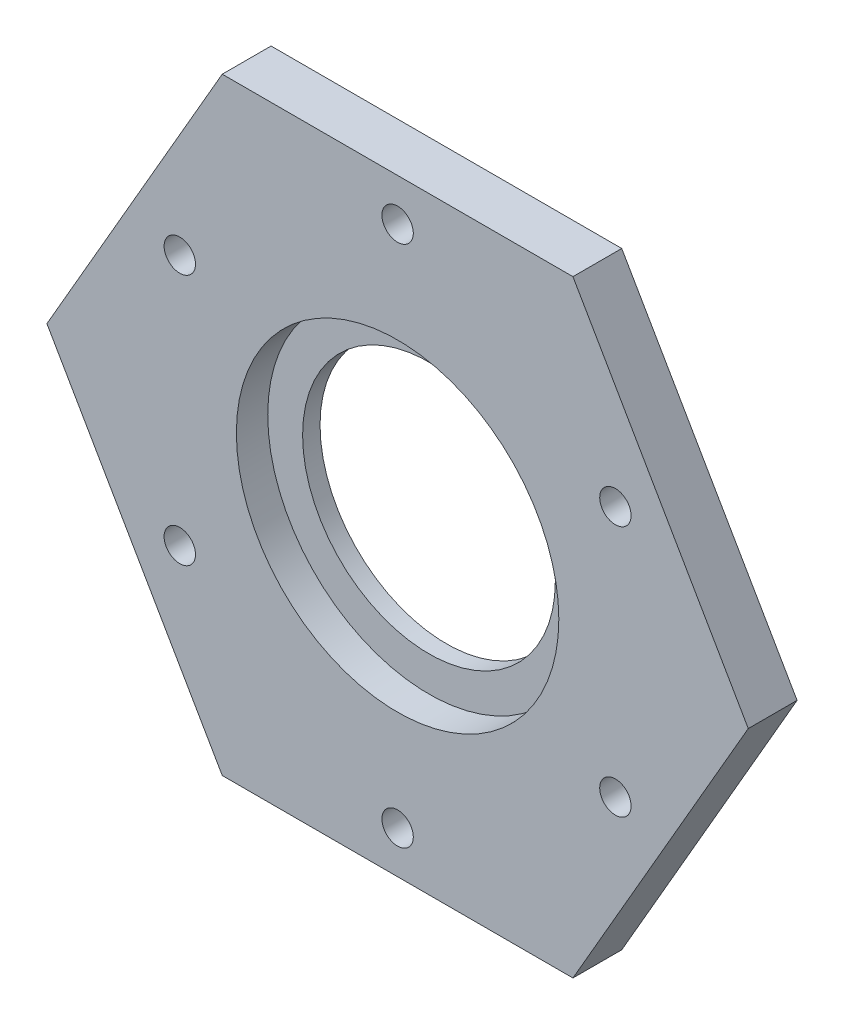
ISO-10303-21;
HEADER;
FILE_DESCRIPTION(('STEP AP214'),'2;1');
FILE_NAME('part.step','',(''),(''),'','','');
FILE_SCHEMA(('AUTOMOTIVE_DESIGN { 1 0 10303 214 1 1 1 1 }'));
ENDSEC;
DATA;
#1=APPLICATION_CONTEXT('core data for automotive mechanical design processes');
#2=APPLICATION_PROTOCOL_DEFINITION('international standard','automotive_design',2000,#1);
#3=PRODUCT_CONTEXT('',#1,'mechanical');
#4=PRODUCT('Part','Part','',(#3));
#5=PRODUCT_RELATED_PRODUCT_CATEGORY('part','',(#4));
#6=PRODUCT_DEFINITION_FORMATION('','',#4);
#7=PRODUCT_DEFINITION_CONTEXT('part definition',#1,'design');
#8=PRODUCT_DEFINITION('design','',#6,#7);
#9=PRODUCT_DEFINITION_SHAPE('','',#8);
#10=(LENGTH_UNIT() NAMED_UNIT(*) SI_UNIT(.MILLI.,.METRE.));
#11=(NAMED_UNIT(*) PLANE_ANGLE_UNIT() SI_UNIT($,.RADIAN.));
#12=(NAMED_UNIT(*) SI_UNIT($,.STERADIAN.) SOLID_ANGLE_UNIT());
#13=UNCERTAINTY_MEASURE_WITH_UNIT(LENGTH_MEASURE(1.E-05),#10,'distance_accuracy_value','');
#14=(GEOMETRIC_REPRESENTATION_CONTEXT(3) GLOBAL_UNCERTAINTY_ASSIGNED_CONTEXT((#13)) GLOBAL_UNIT_ASSIGNED_CONTEXT((#10,
#11,#12)) REPRESENTATION_CONTEXT('',''));
#15=CARTESIAN_POINT('',(0.,0.,0.));
#16=DIRECTION('',(0.,0.,1.));
#17=DIRECTION('',(1.,0.,0.));
#18=AXIS2_PLACEMENT_3D('',#15,#16,#17);
#19=CARTESIAN_POINT('',(0.,0.,-3.8));
#20=DIRECTION('',(0.,0.,1.));
#21=DIRECTION('',(1.,0.,0.));
#22=AXIS2_PLACEMENT_3D('',#19,#20,#21);
#23=CYLINDRICAL_SURFACE('',#22,9.25);
#24=CARTESIAN_POINT('',(0.,0.,-1.));
#25=DIRECTION('',(0.,0.,-1.));
#26=DIRECTION('',(-1.,0.,0.));
#27=AXIS2_PLACEMENT_3D('',#24,#25,#26);
#28=CIRCLE('',#27,9.25);
#29=CARTESIAN_POINT('',(-9.25,0.,-1.));
#30=VERTEX_POINT('',#29);
#31=EDGE_CURVE('E11',#30,#30,#28,.T.);
#32=ORIENTED_EDGE('',*,*,#31,.F.);
#33=EDGE_LOOP('',(#32));
#34=FACE_BOUND('',#33,.T.);
#35=CARTESIAN_POINT('',(0.,0.,-2.8));
#36=DIRECTION('',(0.,0.,-1.));
#37=DIRECTION('',(-1.,0.,0.));
#38=AXIS2_PLACEMENT_3D('',#35,#36,#37);
#39=CIRCLE('',#38,9.25);
#40=CARTESIAN_POINT('',(-9.25,0.,-2.8));
#41=VERTEX_POINT('',#40);
#42=EDGE_CURVE('E182',#41,#41,#39,.T.);
#43=ORIENTED_EDGE('',*,*,#42,.T.);
#44=EDGE_LOOP('',(#43));
#45=FACE_BOUND('',#44,.T.);
#46=ADVANCED_FACE('F39',(#34,#45),#23,.F.);
#47=CARTESIAN_POINT('',(-10.0594010767583,17.4233937586589,-1.));
#48=DIRECTION('',(0.,-1.,0.));
#49=DIRECTION('',(1.,0.,0.));
#50=AXIS2_PLACEMENT_3D('',#47,#48,#49);
#51=PLANE('',#50);
#52=DIRECTION('',(0.,0.,1.));
#53=VECTOR('',#52,1.);
#54=CARTESIAN_POINT('',(-10.0594010767583,17.4233937586589,-1.));
#55=LINE('',#54,#53);
#56=CARTESIAN_POINT('',(-10.0594010767583,17.4233937586589,-3.8));
#57=VERTEX_POINT('',#56);
#58=CARTESIAN_POINT('',(-10.0594010767583,17.4233937586589,-1.));
#59=VERTEX_POINT('',#58);
#60=EDGE_CURVE('E113',#57,#59,#55,.T.);
#61=ORIENTED_EDGE('',*,*,#60,.T.);
#62=DIRECTION('',(1.,0.,0.));
#63=VECTOR('',#62,1.);
#64=CARTESIAN_POINT('',(-10.0594010767583,17.4233937586589,-1.));
#65=LINE('',#64,#63);
#66=CARTESIAN_POINT('',(10.0594010767585,17.4233937586588,-1.));
#67=VERTEX_POINT('',#66);
#68=EDGE_CURVE('E57',#59,#67,#65,.T.);
#69=ORIENTED_EDGE('',*,*,#68,.T.);
#70=DIRECTION('',(0.,0.,1.));
#71=VECTOR('',#70,1.);
#72=CARTESIAN_POINT('',(10.0594010767585,17.4233937586588,-1.));
#73=LINE('',#72,#71);
#74=CARTESIAN_POINT('',(10.0594010767585,17.4233937586588,-3.8));
#75=VERTEX_POINT('',#74);
#76=EDGE_CURVE('E49',#75,#67,#73,.T.);
#77=ORIENTED_EDGE('',*,*,#76,.F.);
#78=DIRECTION('',(1.,0.,0.));
#79=VECTOR('',#78,1.);
#80=CARTESIAN_POINT('',(-10.0594010767583,17.4233937586589,-3.8));
#81=LINE('',#80,#79);
#82=EDGE_CURVE('E141',#57,#75,#81,.T.);
#83=ORIENTED_EDGE('',*,*,#82,.F.);
#84=EDGE_LOOP('',(#61,#69,#77,#83));
#85=FACE_BOUND('',#84,.T.);
#86=ADVANCED_FACE('F41',(#85),#51,.F.);
#87=CARTESIAN_POINT('',(10.0594010767585,17.4233937586588,-1.));
#88=DIRECTION('',(-0.866025403784439,-0.5,0.));
#89=DIRECTION('',(0.5,-0.866025403784439,0.));
#90=AXIS2_PLACEMENT_3D('',#87,#88,#89);
#91=PLANE('',#90);
#92=ORIENTED_EDGE('',*,*,#76,.T.);
#93=DIRECTION('',(0.5,-0.866025403784439,0.));
#94=VECTOR('',#93,1.);
#95=CARTESIAN_POINT('',(10.0594010767585,17.4233937586588,-1.));
#96=LINE('',#95,#94);
#97=CARTESIAN_POINT('',(20.118802153517,0.,-1.));
#98=VERTEX_POINT('',#97);
#99=EDGE_CURVE('E135',#67,#98,#96,.T.);
#100=ORIENTED_EDGE('',*,*,#99,.T.);
#101=DIRECTION('',(0.,0.,1.));
#102=VECTOR('',#101,1.);
#103=CARTESIAN_POINT('',(20.118802153517,0.,-1.));
#104=LINE('',#103,#102);
#105=CARTESIAN_POINT('',(20.118802153517,0.,-3.8));
#106=VERTEX_POINT('',#105);
#107=EDGE_CURVE('E126',#106,#98,#104,.T.);
#108=ORIENTED_EDGE('',*,*,#107,.F.);
#109=DIRECTION('',(0.5,-0.866025403784439,0.));
#110=VECTOR('',#109,1.);
#111=CARTESIAN_POINT('',(10.0594010767585,17.4233937586588,-3.8));
#112=LINE('',#111,#110);
#113=EDGE_CURVE('E137',#75,#106,#112,.T.);
#114=ORIENTED_EDGE('',*,*,#113,.F.);
#115=EDGE_LOOP('',(#92,#100,#108,#114));
#116=FACE_BOUND('',#115,.T.);
#117=ADVANCED_FACE('F134',(#116),#91,.F.);
#118=CARTESIAN_POINT('',(20.118802153517,0.,-1.));
#119=DIRECTION('',(-0.866025403784437,0.500000000000002,0.));
#120=DIRECTION('',(-0.500000000000002,-0.866025403784437,0.));
#121=AXIS2_PLACEMENT_3D('',#118,#119,#120);
#122=PLANE('',#121);
#123=ORIENTED_EDGE('',*,*,#107,.T.);
#124=DIRECTION('',(-0.500000000000002,-0.866025403784437,0.));
#125=VECTOR('',#124,1.);
#126=CARTESIAN_POINT('',(20.118802153517,0.,-1.));
#127=LINE('',#126,#125);
#128=CARTESIAN_POINT('',(10.0594010767584,-17.4233937586588,-1.));
#129=VERTEX_POINT('',#128);
#130=EDGE_CURVE('E170',#98,#129,#127,.T.);
#131=ORIENTED_EDGE('',*,*,#130,.T.);
#132=DIRECTION('',(0.,0.,1.));
#133=VECTOR('',#132,1.);
#134=CARTESIAN_POINT('',(10.0594010767584,-17.4233937586588,-1.));
#135=LINE('',#134,#133);
#136=CARTESIAN_POINT('',(10.0594010767584,-17.4233937586588,-3.8));
#137=VERTEX_POINT('',#136);
#138=EDGE_CURVE('E117',#137,#129,#135,.T.);
#139=ORIENTED_EDGE('',*,*,#138,.F.);
#140=DIRECTION('',(-0.500000000000002,-0.866025403784437,0.));
#141=VECTOR('',#140,1.);
#142=CARTESIAN_POINT('',(20.118802153517,0.,-3.8));
#143=LINE('',#142,#141);
#144=EDGE_CURVE('E151',#106,#137,#143,.T.);
#145=ORIENTED_EDGE('',*,*,#144,.F.);
#146=EDGE_LOOP('',(#123,#131,#139,#145));
#147=FACE_BOUND('',#146,.T.);
#148=ADVANCED_FACE('F273',(#147),#122,.F.);
#149=CARTESIAN_POINT('',(10.0594010767584,-17.4233937586588,-1.));
#150=DIRECTION('',(0.,1.,0.));
#151=DIRECTION('',(-1.,0.,0.));
#152=AXIS2_PLACEMENT_3D('',#149,#150,#151);
#153=PLANE('',#152);
#154=ORIENTED_EDGE('',*,*,#138,.T.);
#155=DIRECTION('',(-1.,0.,0.));
#156=VECTOR('',#155,1.);
#157=CARTESIAN_POINT('',(10.0594010767584,-17.4233937586588,-1.));
#158=LINE('',#157,#156);
#159=CARTESIAN_POINT('',(-10.0594010767586,-17.4233937586587,-1.));
#160=VERTEX_POINT('',#159);
#161=EDGE_CURVE('E166',#129,#160,#158,.T.);
#162=ORIENTED_EDGE('',*,*,#161,.T.);
#163=DIRECTION('',(0.,0.,1.));
#164=VECTOR('',#163,1.);
#165=CARTESIAN_POINT('',(-10.0594010767586,-17.4233937586587,-1.));
#166=LINE('',#165,#164);
#167=CARTESIAN_POINT('',(-10.0594010767586,-17.4233937586587,-3.8));
#168=VERTEX_POINT('',#167);
#169=EDGE_CURVE('E105',#168,#160,#166,.T.);
#170=ORIENTED_EDGE('',*,*,#169,.F.);
#171=DIRECTION('',(-1.,0.,0.));
#172=VECTOR('',#171,1.);
#173=CARTESIAN_POINT('',(10.0594010767584,-17.4233937586588,-3.8));
#174=LINE('',#173,#172);
#175=EDGE_CURVE('E159',#137,#168,#174,.T.);
#176=ORIENTED_EDGE('',*,*,#175,.F.);
#177=EDGE_LOOP('',(#154,#162,#170,#176));
#178=FACE_BOUND('',#177,.T.);
#179=ADVANCED_FACE('F165',(#178),#153,.F.);
#180=CARTESIAN_POINT('',(-10.0594010767586,-17.4233937586587,-1.));
#181=DIRECTION('',(0.866025403784442,0.499999999999994,0.));
#182=DIRECTION('',(-0.499999999999994,0.866025403784442,0.));
#183=AXIS2_PLACEMENT_3D('',#180,#181,#182);
#184=PLANE('',#183);
#185=ORIENTED_EDGE('',*,*,#169,.T.);
#186=DIRECTION('',(0.499999999999994,-0.866025403784442,0.));
#187=VECTOR('',#186,1.);
#188=CARTESIAN_POINT('',(-4.73557497366824,-26.6445310598728,-1.));
#189=LINE('',#188,#187);
#190=CARTESIAN_POINT('',(-20.118802153517,1.59594559789866E-13,-1.));
#191=VERTEX_POINT('',#190);
#192=EDGE_CURVE('E96',#191,#160,#189,.T.);
#193=ORIENTED_EDGE('',*,*,#192,.F.);
#194=DIRECTION('',(0.,0.,1.));
#195=VECTOR('',#194,1.);
#196=CARTESIAN_POINT('',(-20.118802153517,1.6826817716975E-13,-1.));
#197=LINE('',#196,#195);
#198=CARTESIAN_POINT('',(-20.118802153517,1.6826817716975E-13,-3.8));
#199=VERTEX_POINT('',#198);
#200=EDGE_CURVE('E65',#199,#191,#197,.T.);
#201=ORIENTED_EDGE('',*,*,#200,.F.);
#202=DIRECTION('',(-0.499999999999994,0.866025403784442,0.));
#203=VECTOR('',#202,1.);
#204=CARTESIAN_POINT('',(-10.0594010767586,-17.4233937586587,-3.8));
#205=LINE('',#204,#203);
#206=EDGE_CURVE('E119',#168,#199,#205,.T.);
#207=ORIENTED_EDGE('',*,*,#206,.F.);
#208=EDGE_LOOP('',(#185,#193,#201,#207));
#209=FACE_BOUND('',#208,.T.);
#210=ADVANCED_FACE('F104',(#209),#184,.F.);
#211=CARTESIAN_POINT('',(-20.118802153517,1.6826817716975E-13,-1.));
#212=DIRECTION('',(0.866025403784434,-0.500000000000008,0.));
#213=DIRECTION('',(0.500000000000008,0.866025403784434,0.));
#214=AXIS2_PLACEMENT_3D('',#211,#212,#213);
#215=PLANE('',#214);
#216=ORIENTED_EDGE('',*,*,#200,.T.);
#217=DIRECTION('',(0.500000000000008,0.866025403784434,0.));
#218=VECTOR('',#217,1.);
#219=CARTESIAN_POINT('',(-20.118802153517,1.6826817716975E-13,-1.));
#220=LINE('',#219,#218);
#221=EDGE_CURVE('E94',#191,#59,#220,.T.);
#222=ORIENTED_EDGE('',*,*,#221,.T.);
#223=ORIENTED_EDGE('',*,*,#60,.F.);
#224=DIRECTION('',(0.500000000000008,0.866025403784434,0.));
#225=VECTOR('',#224,1.);
#226=CARTESIAN_POINT('',(-20.118802153517,1.6826817716975E-13,-3.8));
#227=LINE('',#226,#225);
#228=EDGE_CURVE('E111',#199,#57,#227,.T.);
#229=ORIENTED_EDGE('',*,*,#228,.F.);
#230=EDGE_LOOP('',(#216,#222,#223,#229));
#231=FACE_BOUND('',#230,.T.);
#232=ADVANCED_FACE('F109',(#231),#215,.F.);
#233=CARTESIAN_POINT('',(0.,-15.,5.));
#234=DIRECTION('',(0.,0.,-1.));
#235=DIRECTION('',(-1.,0.,0.));
#236=AXIS2_PLACEMENT_3D('',#233,#234,#235);
#237=CYLINDRICAL_SURFACE('',#236,0.9);
#238=CARTESIAN_POINT('',(0.,-15.,-1.));
#239=DIRECTION('',(0.,0.,-1.));
#240=DIRECTION('',(-1.,0.,0.));
#241=AXIS2_PLACEMENT_3D('',#238,#239,#240);
#242=CIRCLE('',#241,0.9);
#243=CARTESIAN_POINT('',(-0.9,-15.,-1.));
#244=VERTEX_POINT('',#243);
#245=EDGE_CURVE('E101',#244,#244,#242,.T.);
#246=ORIENTED_EDGE('',*,*,#245,.F.);
#247=EDGE_LOOP('',(#246));
#248=FACE_BOUND('',#247,.T.);
#249=CARTESIAN_POINT('',(0.,-15.,-3.8));
#250=DIRECTION('',(0.,0.,-1.));
#251=DIRECTION('',(-1.,0.,0.));
#252=AXIS2_PLACEMENT_3D('',#249,#250,#251);
#253=CIRCLE('',#252,0.900000000000001);
#254=CARTESIAN_POINT('',(-0.900000000000001,-15.,-3.8));
#255=VERTEX_POINT('',#254);
#256=EDGE_CURVE('E199',#255,#255,#253,.T.);
#257=ORIENTED_EDGE('',*,*,#256,.T.);
#258=EDGE_LOOP('',(#257));
#259=FACE_BOUND('',#258,.T.);
#260=ADVANCED_FACE('F262',(#248,#259),#237,.F.);
#261=CARTESIAN_POINT('',(12.4951905283833,-7.21410161513772,5.));
#262=DIRECTION('',(0.,0.,-1.));
#263=DIRECTION('',(-1.,0.,0.));
#264=AXIS2_PLACEMENT_3D('',#261,#262,#263);
#265=CYLINDRICAL_SURFACE('',#264,0.9);
#266=CARTESIAN_POINT('',(12.4951905283833,-7.21410161513772,-1.));
#267=DIRECTION('',(0.,0.,-1.));
#268=DIRECTION('',(-1.,0.,0.));
#269=AXIS2_PLACEMENT_3D('',#266,#267,#268);
#270=CIRCLE('',#269,0.9);
#271=CARTESIAN_POINT('',(11.5951905283833,-7.21410161513772,-1.));
#272=VERTEX_POINT('',#271);
#273=EDGE_CURVE('E424',#272,#272,#270,.T.);
#274=ORIENTED_EDGE('',*,*,#273,.F.);
#275=EDGE_LOOP('',(#274));
#276=FACE_BOUND('',#275,.T.);
#277=CARTESIAN_POINT('',(12.4951905283833,-7.21410161513772,-3.8));
#278=DIRECTION('',(0.,0.,-1.));
#279=DIRECTION('',(-1.,0.,0.));
#280=AXIS2_PLACEMENT_3D('',#277,#278,#279);
#281=CIRCLE('',#280,0.899999999999999);
#282=CARTESIAN_POINT('',(11.5951905283833,-7.21410161513772,-3.8));
#283=VERTEX_POINT('',#282);
#284=EDGE_CURVE('E203',#283,#283,#281,.T.);
#285=ORIENTED_EDGE('',*,*,#284,.T.);
#286=EDGE_LOOP('',(#285));
#287=FACE_BOUND('',#286,.T.);
#288=ADVANCED_FACE('F258',(#276,#287),#265,.F.);
#289=CARTESIAN_POINT('',(-12.4951905283833,-7.21410161513772,5.));
#290=DIRECTION('',(0.,0.,-1.));
#291=DIRECTION('',(-1.,0.,0.));
#292=AXIS2_PLACEMENT_3D('',#289,#290,#291);
#293=CYLINDRICAL_SURFACE('',#292,0.9);
#294=CARTESIAN_POINT('',(-12.4951905283833,-7.21410161513772,-1.));
#295=DIRECTION('',(0.,0.,-1.));
#296=DIRECTION('',(-1.,0.,0.));
#297=AXIS2_PLACEMENT_3D('',#294,#295,#296);
#298=CIRCLE('',#297,0.9);
#299=CARTESIAN_POINT('',(-13.3951905283833,-7.21410161513772,-1.));
#300=VERTEX_POINT('',#299);
#301=EDGE_CURVE('E428',#300,#300,#298,.F.);
#302=ORIENTED_EDGE('',*,*,#301,.T.);
#303=EDGE_LOOP('',(#302));
#304=FACE_BOUND('',#303,.T.);
#305=CARTESIAN_POINT('',(-12.4951905283833,-7.21410161513772,-3.8));
#306=DIRECTION('',(0.,0.,-1.));
#307=DIRECTION('',(-1.,0.,0.));
#308=AXIS2_PLACEMENT_3D('',#305,#306,#307);
#309=CIRCLE('',#308,0.9);
#310=CARTESIAN_POINT('',(-13.3951905283833,-7.21410161513772,-3.8));
#311=VERTEX_POINT('',#310);
#312=EDGE_CURVE('E195',#311,#311,#309,.T.);
#313=ORIENTED_EDGE('',*,*,#312,.T.);
#314=EDGE_LOOP('',(#313));
#315=FACE_BOUND('',#314,.T.);
#316=ADVANCED_FACE('F254',(#304,#315),#293,.F.);
#317=CARTESIAN_POINT('',(-12.4951905283833,7.21410161513772,5.));
#318=DIRECTION('',(0.,0.,-1.));
#319=DIRECTION('',(-1.,0.,0.));
#320=AXIS2_PLACEMENT_3D('',#317,#318,#319);
#321=CYLINDRICAL_SURFACE('',#320,0.9);
#322=CARTESIAN_POINT('',(-12.4951905283833,7.21410161513772,-1.));
#323=DIRECTION('',(0.,0.,-1.));
#324=DIRECTION('',(-1.,0.,0.));
#325=AXIS2_PLACEMENT_3D('',#322,#323,#324);
#326=CIRCLE('',#325,0.9);
#327=CARTESIAN_POINT('',(-13.3951905283833,7.21410161513772,-1.));
#328=VERTEX_POINT('',#327);
#329=EDGE_CURVE('E432',#328,#328,#326,.T.);
#330=ORIENTED_EDGE('',*,*,#329,.F.);
#331=EDGE_LOOP('',(#330));
#332=FACE_BOUND('',#331,.T.);
#333=CARTESIAN_POINT('',(-12.4951905283833,7.21410161513772,-3.8));
#334=DIRECTION('',(0.,0.,-1.));
#335=DIRECTION('',(-1.,0.,0.));
#336=AXIS2_PLACEMENT_3D('',#333,#334,#335);
#337=CIRCLE('',#336,0.9);
#338=CARTESIAN_POINT('',(-13.3951905283833,7.21410161513772,-3.8));
#339=VERTEX_POINT('',#338);
#340=EDGE_CURVE('E191',#339,#339,#337,.T.);
#341=ORIENTED_EDGE('',*,*,#340,.T.);
#342=EDGE_LOOP('',(#341));
#343=FACE_BOUND('',#342,.T.);
#344=ADVANCED_FACE('F250',(#332,#343),#321,.F.);
#345=CARTESIAN_POINT('',(12.4951905283833,7.21410161513772,5.));
#346=DIRECTION('',(0.,0.,-1.));
#347=DIRECTION('',(-1.,0.,0.));
#348=AXIS2_PLACEMENT_3D('',#345,#346,#347);
#349=CYLINDRICAL_SURFACE('',#348,0.9);
#350=CARTESIAN_POINT('',(12.4951905283833,7.21410161513772,-1.));
#351=DIRECTION('',(0.,0.,-1.));
#352=DIRECTION('',(-1.,0.,0.));
#353=AXIS2_PLACEMENT_3D('',#350,#351,#352);
#354=CIRCLE('',#353,0.9);
#355=CARTESIAN_POINT('',(11.5951905283833,7.21410161513772,-1.));
#356=VERTEX_POINT('',#355);
#357=EDGE_CURVE('E436',#356,#356,#354,.F.);
#358=ORIENTED_EDGE('',*,*,#357,.T.);
#359=EDGE_LOOP('',(#358));
#360=FACE_BOUND('',#359,.T.);
#361=CARTESIAN_POINT('',(12.4951905283833,7.21410161513772,-3.8));
#362=DIRECTION('',(0.,0.,-1.));
#363=DIRECTION('',(-1.,0.,0.));
#364=AXIS2_PLACEMENT_3D('',#361,#362,#363);
#365=CIRCLE('',#364,0.899999999999999);
#366=CARTESIAN_POINT('',(11.5951905283833,7.21410161513772,-3.8));
#367=VERTEX_POINT('',#366);
#368=EDGE_CURVE('E153',#367,#367,#365,.T.);
#369=ORIENTED_EDGE('',*,*,#368,.T.);
#370=EDGE_LOOP('',(#369));
#371=FACE_BOUND('',#370,.T.);
#372=ADVANCED_FACE('F210',(#360,#371),#349,.F.);
#373=CARTESIAN_POINT('',(0.,15.,5.));
#374=DIRECTION('',(0.,0.,-1.));
#375=DIRECTION('',(-1.,0.,0.));
#376=AXIS2_PLACEMENT_3D('',#373,#374,#375);
#377=CYLINDRICAL_SURFACE('',#376,0.9);
#378=CARTESIAN_POINT('',(0.,15.,-1.));
#379=DIRECTION('',(0.,0.,-1.));
#380=DIRECTION('',(-1.,0.,0.));
#381=AXIS2_PLACEMENT_3D('',#378,#379,#380);
#382=CIRCLE('',#381,0.9);
#383=CARTESIAN_POINT('',(-0.9,15.,-1.));
#384=VERTEX_POINT('',#383);
#385=EDGE_CURVE('E43',#384,#384,#382,.F.);
#386=ORIENTED_EDGE('',*,*,#385,.T.);
#387=EDGE_LOOP('',(#386));
#388=FACE_BOUND('',#387,.T.);
#389=CARTESIAN_POINT('',(0.,15.,-3.8));
#390=DIRECTION('',(0.,0.,-1.));
#391=DIRECTION('',(-1.,0.,0.));
#392=AXIS2_PLACEMENT_3D('',#389,#390,#391);
#393=CIRCLE('',#392,0.899999999999999);
#394=CARTESIAN_POINT('',(-0.899999999999999,15.,-3.8));
#395=VERTEX_POINT('',#394);
#396=EDGE_CURVE('E186',#395,#395,#393,.T.);
#397=ORIENTED_EDGE('',*,*,#396,.T.);
#398=EDGE_LOOP('',(#397));
#399=FACE_BOUND('',#398,.T.);
#400=ADVANCED_FACE('F214',(#388,#399),#377,.F.);
#401=CARTESIAN_POINT('',(0.,0.,-3.8));
#402=DIRECTION('',(0.,0.,-1.));
#403=DIRECTION('',(-1.,0.,0.));
#404=AXIS2_PLACEMENT_3D('',#401,#402,#403);
#405=PLANE('',#404);
#406=ORIENTED_EDGE('',*,*,#396,.F.);
#407=EDGE_LOOP('',(#406));
#408=FACE_BOUND('',#407,.T.);
#409=ORIENTED_EDGE('',*,*,#312,.F.);
#410=EDGE_LOOP('',(#409));
#411=FACE_BOUND('',#410,.T.);
#412=ORIENTED_EDGE('',*,*,#284,.F.);
#413=EDGE_LOOP('',(#412));
#414=FACE_BOUND('',#413,.T.);
#415=ORIENTED_EDGE('',*,*,#228,.T.);
#416=ORIENTED_EDGE('',*,*,#82,.T.);
#417=ORIENTED_EDGE('',*,*,#113,.T.);
#418=ORIENTED_EDGE('',*,*,#144,.T.);
#419=ORIENTED_EDGE('',*,*,#175,.T.);
#420=ORIENTED_EDGE('',*,*,#206,.T.);
#421=EDGE_LOOP('',(#415,#416,#417,#418,#419,#420));
#422=FACE_BOUND('',#421,.T.);
#423=ORIENTED_EDGE('',*,*,#368,.F.);
#424=EDGE_LOOP('',(#423));
#425=FACE_BOUND('',#424,.T.);
#426=ORIENTED_EDGE('',*,*,#256,.F.);
#427=EDGE_LOOP('',(#426));
#428=FACE_BOUND('',#427,.T.);
#429=ORIENTED_EDGE('',*,*,#340,.F.);
#430=EDGE_LOOP('',(#429));
#431=FACE_BOUND('',#430,.T.);
#432=CARTESIAN_POINT('',(0.,0.,-3.8));
#433=DIRECTION('',(0.,0.,-1.));
#434=DIRECTION('',(-1.,0.,0.));
#435=AXIS2_PLACEMENT_3D('',#432,#433,#434);
#436=CIRCLE('',#435,7.25);
#437=CARTESIAN_POINT('',(-7.25,0.,-3.8));
#438=VERTEX_POINT('',#437);
#439=EDGE_CURVE('E169',#438,#438,#436,.T.);
#440=ORIENTED_EDGE('',*,*,#439,.F.);
#441=EDGE_LOOP('',(#440));
#442=FACE_BOUND('',#441,.T.);
#443=ADVANCED_FACE('F143',(#408,#411,#414,#422,#425,#428,#431,#442),#405,.T.);
#444=CARTESIAN_POINT('',(0.,0.,-2.8));
#445=DIRECTION('',(0.,0.,-1.));
#446=DIRECTION('',(-1.,0.,0.));
#447=AXIS2_PLACEMENT_3D('',#444,#445,#446);
#448=PLANE('',#447);
#449=CARTESIAN_POINT('',(0.,0.,-2.8));
#450=DIRECTION('',(0.,0.,-1.));
#451=DIRECTION('',(-1.,0.,0.));
#452=AXIS2_PLACEMENT_3D('',#449,#450,#451);
#453=CIRCLE('',#452,7.25);
#454=CARTESIAN_POINT('',(-7.25,0.,-2.8));
#455=VERTEX_POINT('',#454);
#456=EDGE_CURVE('E175',#455,#455,#453,.T.);
#457=ORIENTED_EDGE('',*,*,#456,.T.);
#458=EDGE_LOOP('',(#457));
#459=FACE_BOUND('',#458,.T.);
#460=ORIENTED_EDGE('',*,*,#42,.F.);
#461=EDGE_LOOP('',(#460));
#462=FACE_BOUND('',#461,.T.);
#463=ADVANCED_FACE('F213',(#459,#462),#448,.F.);
#464=CARTESIAN_POINT('',(0.,0.,-2.8));
#465=DIRECTION('',(0.,0.,-1.));
#466=DIRECTION('',(-1.,0.,0.));
#467=AXIS2_PLACEMENT_3D('',#464,#465,#466);
#468=CYLINDRICAL_SURFACE('',#467,7.25);
#469=ORIENTED_EDGE('',*,*,#456,.F.);
#470=EDGE_LOOP('',(#469));
#471=FACE_BOUND('',#470,.T.);
#472=ORIENTED_EDGE('',*,*,#439,.T.);
#473=EDGE_LOOP('',(#472));
#474=FACE_BOUND('',#473,.T.);
#475=ADVANCED_FACE('F223',(#471,#474),#468,.F.);
#476=CARTESIAN_POINT('',(0.,0.,-1.));
#477=DIRECTION('',(0.,0.,-1.));
#478=DIRECTION('',(-1.,0.,0.));
#479=AXIS2_PLACEMENT_3D('',#476,#477,#478);
#480=PLANE('',#479);
#481=ORIENTED_EDGE('',*,*,#31,.T.);
#482=EDGE_LOOP('',(#481));
#483=FACE_BOUND('',#482,.T.);
#484=ORIENTED_EDGE('',*,*,#245,.T.);
#485=EDGE_LOOP('',(#484));
#486=FACE_BOUND('',#485,.T.);
#487=ORIENTED_EDGE('',*,*,#273,.T.);
#488=EDGE_LOOP('',(#487));
#489=FACE_BOUND('',#488,.T.);
#490=ORIENTED_EDGE('',*,*,#357,.F.);
#491=EDGE_LOOP('',(#490));
#492=FACE_BOUND('',#491,.T.);
#493=ORIENTED_EDGE('',*,*,#385,.F.);
#494=EDGE_LOOP('',(#493));
#495=FACE_BOUND('',#494,.T.);
#496=ORIENTED_EDGE('',*,*,#329,.T.);
#497=EDGE_LOOP('',(#496));
#498=FACE_BOUND('',#497,.T.);
#499=ORIENTED_EDGE('',*,*,#301,.F.);
#500=EDGE_LOOP('',(#499));
#501=FACE_BOUND('',#500,.T.);
#502=ORIENTED_EDGE('',*,*,#130,.F.);
#503=ORIENTED_EDGE('',*,*,#99,.F.);
#504=ORIENTED_EDGE('',*,*,#68,.F.);
#505=ORIENTED_EDGE('',*,*,#221,.F.);
#506=ORIENTED_EDGE('',*,*,#192,.T.);
#507=ORIENTED_EDGE('',*,*,#161,.F.);
#508=EDGE_LOOP('',(#502,#503,#504,#505,#506,#507));
#509=FACE_BOUND('',#508,.T.);
#510=ADVANCED_FACE('F95',(#483,#486,#489,#492,#495,#498,#501,#509),#480,.F.);
#511=CLOSED_SHELL('',(#46,#86,#117,#148,#179,#210,#232,#260,#288,#316,#344,#372,#400,#443,#463,
#475,#510));
#512=MANIFOLD_SOLID_BREP('B2',#511);
#513=ADVANCED_BREP_SHAPE_REPRESENTATION('',(#18,#512),#14);
#514=SHAPE_DEFINITION_REPRESENTATION(#9,#513);
ENDSEC;
END-ISO-10303-21;
